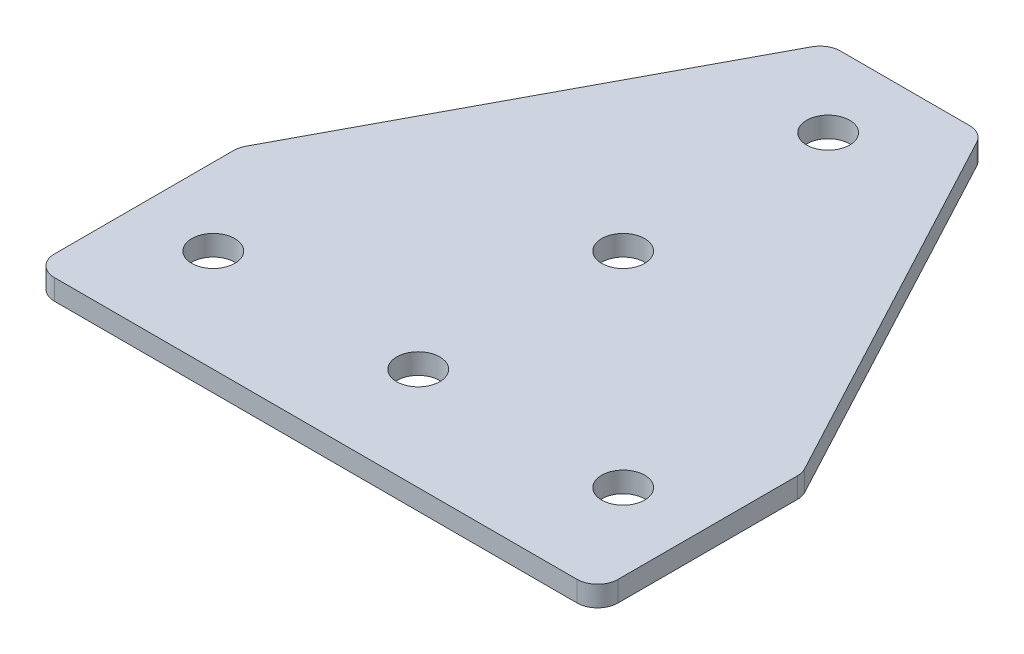
ISO-10303-21;
HEADER;
FILE_DESCRIPTION(('STEP AP214'),'2;1');
FILE_NAME('part.step','',(''),(''),'','','');
FILE_SCHEMA(('AUTOMOTIVE_DESIGN { 1 0 10303 214 1 1 1 1 }'));
ENDSEC;
DATA;
#1=APPLICATION_CONTEXT('core data for automotive mechanical design processes');
#2=APPLICATION_PROTOCOL_DEFINITION('international standard','automotive_design',2000,#1);
#3=PRODUCT_CONTEXT('',#1,'mechanical');
#4=PRODUCT('Part','Part','',(#3));
#5=PRODUCT_RELATED_PRODUCT_CATEGORY('part','',(#4));
#6=PRODUCT_DEFINITION_FORMATION('','',#4);
#7=PRODUCT_DEFINITION_CONTEXT('part definition',#1,'design');
#8=PRODUCT_DEFINITION('design','',#6,#7);
#9=PRODUCT_DEFINITION_SHAPE('','',#8);
#10=(LENGTH_UNIT() NAMED_UNIT(*) SI_UNIT(.MILLI.,.METRE.));
#11=(NAMED_UNIT(*) PLANE_ANGLE_UNIT() SI_UNIT($,.RADIAN.));
#12=(NAMED_UNIT(*) SI_UNIT($,.STERADIAN.) SOLID_ANGLE_UNIT());
#13=UNCERTAINTY_MEASURE_WITH_UNIT(LENGTH_MEASURE(1.E-05),#10,'distance_accuracy_value','');
#14=(GEOMETRIC_REPRESENTATION_CONTEXT(3) GLOBAL_UNCERTAINTY_ASSIGNED_CONTEXT((#13)) GLOBAL_UNIT_ASSIGNED_CONTEXT((#10,
#11,#12)) REPRESENTATION_CONTEXT('',''));
#15=CARTESIAN_POINT('',(0.,0.,0.));
#16=DIRECTION('',(0.,0.,1.));
#17=DIRECTION('',(1.,0.,0.));
#18=AXIS2_PLACEMENT_3D('',#15,#16,#17);
#19=CARTESIAN_POINT('',(0.,2.,0.));
#20=DIRECTION('',(0.,1.,0.));
#21=DIRECTION('',(0.,0.,1.));
#22=AXIS2_PLACEMENT_3D('',#19,#20,#21);
#23=PLANE('',#22);
#24=CARTESIAN_POINT('',(27.5,2.,-50.));
#25=DIRECTION('',(0.,1.,0.));
#26=DIRECTION('',(0.,0.,1.));
#27=AXIS2_PLACEMENT_3D('',#24,#25,#26);
#28=CIRCLE('',#27,2.1);
#29=CARTESIAN_POINT('',(27.5,2.,-47.9));
#30=VERTEX_POINT('',#29);
#31=EDGE_CURVE('E498',#30,#30,#28,.T.);
#32=ORIENTED_EDGE('',*,*,#31,.F.);
#33=EDGE_LOOP('',(#32));
#34=FACE_BOUND('',#33,.T.);
#35=CARTESIAN_POINT('',(47.5,2.,-10.));
#36=DIRECTION('',(0.,1.,0.));
#37=DIRECTION('',(0.,0.,-1.));
#38=AXIS2_PLACEMENT_3D('',#35,#36,#37);
#39=CIRCLE('',#38,2.1);
#40=CARTESIAN_POINT('',(47.5,2.,-12.1));
#41=VERTEX_POINT('',#40);
#42=EDGE_CURVE('E210',#41,#41,#39,.T.);
#43=ORIENTED_EDGE('',*,*,#42,.F.);
#44=EDGE_LOOP('',(#43));
#45=FACE_BOUND('',#44,.T.);
#46=DIRECTION('',(-0.470588235294118,0.,0.882352941176471));
#47=VECTOR('',#46,1.);
#48=CARTESIAN_POINT('',(20.,2.,-57.5));
#49=LINE('',#48,#47);
#50=CARTESIAN_POINT('',(19.4352941176471,2.,-56.4411764705882));
#51=VERTEX_POINT('',#50);
#52=CARTESIAN_POINT('',(0.235294117647056,2.,-20.4411764705882));
#53=VERTEX_POINT('',#52);
#54=EDGE_CURVE('E167',#51,#53,#49,.T.);
#55=ORIENTED_EDGE('',*,*,#54,.T.);
#56=CARTESIAN_POINT('',(2.,2.,-19.5));
#57=DIRECTION('',(0.,1.,0.));
#58=DIRECTION('',(0.,0.,1.));
#59=AXIS2_PLACEMENT_3D('',#56,#57,#58);
#60=CIRCLE('',#59,2.);
#61=CARTESIAN_POINT('',(0.,2.,-19.5));
#62=VERTEX_POINT('',#61);
#63=EDGE_CURVE('E229',#53,#62,#60,.T.);
#64=ORIENTED_EDGE('',*,*,#63,.T.);
#65=DIRECTION('',(0.,0.,1.));
#66=VECTOR('',#65,1.);
#67=CARTESIAN_POINT('',(0.,2.,-20.));
#68=LINE('',#67,#66);
#69=CARTESIAN_POINT('',(0.,2.,-2.));
#70=VERTEX_POINT('',#69);
#71=EDGE_CURVE('E149',#62,#70,#68,.T.);
#72=ORIENTED_EDGE('',*,*,#71,.T.);
#73=CARTESIAN_POINT('',(2.,2.,-2.));
#74=DIRECTION('',(0.,1.,0.));
#75=DIRECTION('',(0.,0.,1.));
#76=AXIS2_PLACEMENT_3D('',#73,#74,#75);
#77=CIRCLE('',#76,2.);
#78=CARTESIAN_POINT('',(2.,2.,0.));
#79=VERTEX_POINT('',#78);
#80=EDGE_CURVE('E225',#70,#79,#77,.T.);
#81=ORIENTED_EDGE('',*,*,#80,.T.);
#82=DIRECTION('',(1.,0.,0.));
#83=VECTOR('',#82,1.);
#84=CARTESIAN_POINT('',(0.,2.,0.));
#85=LINE('',#84,#83);
#86=CARTESIAN_POINT('',(53.,2.,0.));
#87=VERTEX_POINT('',#86);
#88=EDGE_CURVE('E214',#79,#87,#85,.T.);
#89=ORIENTED_EDGE('',*,*,#88,.T.);
#90=CARTESIAN_POINT('',(53.,2.,-2.));
#91=DIRECTION('',(0.,1.,0.));
#92=DIRECTION('',(0.,0.,1.));
#93=AXIS2_PLACEMENT_3D('',#90,#91,#92);
#94=CIRCLE('',#93,2.);
#95=CARTESIAN_POINT('',(55.,2.,-2.));
#96=VERTEX_POINT('',#95);
#97=EDGE_CURVE('E230',#87,#96,#94,.T.);
#98=ORIENTED_EDGE('',*,*,#97,.T.);
#99=DIRECTION('',(0.,0.,-1.));
#100=VECTOR('',#99,1.);
#101=CARTESIAN_POINT('',(55.,2.,0.));
#102=LINE('',#101,#100);
#103=CARTESIAN_POINT('',(55.,2.,-19.5));
#104=VERTEX_POINT('',#103);
#105=EDGE_CURVE('E271',#96,#104,#102,.T.);
#106=ORIENTED_EDGE('',*,*,#105,.T.);
#107=CARTESIAN_POINT('',(53.,2.,-19.5));
#108=DIRECTION('',(0.,1.,0.));
#109=DIRECTION('',(0.,0.,1.));
#110=AXIS2_PLACEMENT_3D('',#107,#108,#109);
#111=CIRCLE('',#110,2.);
#112=CARTESIAN_POINT('',(54.7647058823529,2.,-20.4411764705882));
#113=VERTEX_POINT('',#112);
#114=EDGE_CURVE('E279',#104,#113,#111,.T.);
#115=ORIENTED_EDGE('',*,*,#114,.T.);
#116=DIRECTION('',(-0.470588235294118,0.,-0.882352941176471));
#117=VECTOR('',#116,1.);
#118=CARTESIAN_POINT('',(55.,2.,-20.));
#119=LINE('',#118,#117);
#120=CARTESIAN_POINT('',(35.5647058823529,2.,-56.4411764705882));
#121=VERTEX_POINT('',#120);
#122=EDGE_CURVE('E255',#113,#121,#119,.T.);
#123=ORIENTED_EDGE('',*,*,#122,.T.);
#124=CARTESIAN_POINT('',(33.8,2.,-55.5));
#125=DIRECTION('',(0.,1.,0.));
#126=DIRECTION('',(0.,0.,1.));
#127=AXIS2_PLACEMENT_3D('',#124,#125,#126);
#128=CIRCLE('',#127,2.);
#129=CARTESIAN_POINT('',(33.8,2.,-57.5));
#130=VERTEX_POINT('',#129);
#131=EDGE_CURVE('E60',#121,#130,#128,.T.);
#132=ORIENTED_EDGE('',*,*,#131,.T.);
#133=DIRECTION('',(-1.,0.,0.));
#134=VECTOR('',#133,1.);
#135=CARTESIAN_POINT('',(35.,2.,-57.5));
#136=LINE('',#135,#134);
#137=CARTESIAN_POINT('',(21.2,2.,-57.5));
#138=VERTEX_POINT('',#137);
#139=EDGE_CURVE('E264',#130,#138,#136,.T.);
#140=ORIENTED_EDGE('',*,*,#139,.T.);
#141=CARTESIAN_POINT('',(21.2,2.,-55.5));
#142=DIRECTION('',(0.,1.,0.));
#143=DIRECTION('',(0.,0.,1.));
#144=AXIS2_PLACEMENT_3D('',#141,#142,#143);
#145=CIRCLE('',#144,2.);
#146=EDGE_CURVE('E192',#138,#51,#145,.T.);
#147=ORIENTED_EDGE('',*,*,#146,.T.);
#148=EDGE_LOOP('',(#55,#64,#72,#81,#89,#98,#106,#115,#123,#132,#140,#147));
#149=FACE_BOUND('',#148,.T.);
#150=CARTESIAN_POINT('',(7.5,2.,-10.));
#151=DIRECTION('',(0.,1.,0.));
#152=DIRECTION('',(0.,0.,1.));
#153=AXIS2_PLACEMENT_3D('',#150,#151,#152);
#154=CIRCLE('',#153,2.1);
#155=CARTESIAN_POINT('',(7.5,2.,-7.9));
#156=VERTEX_POINT('',#155);
#157=EDGE_CURVE('E157',#156,#156,#154,.T.);
#158=ORIENTED_EDGE('',*,*,#157,.F.);
#159=EDGE_LOOP('',(#158));
#160=FACE_BOUND('',#159,.T.);
#161=CARTESIAN_POINT('',(27.5,2.,-10.));
#162=DIRECTION('',(0.,1.,0.));
#163=DIRECTION('',(0.,0.,1.));
#164=AXIS2_PLACEMENT_3D('',#161,#162,#163);
#165=CIRCLE('',#164,2.1);
#166=CARTESIAN_POINT('',(27.5,2.,-7.9));
#167=VERTEX_POINT('',#166);
#168=EDGE_CURVE('E509',#167,#167,#165,.T.);
#169=ORIENTED_EDGE('',*,*,#168,.F.);
#170=EDGE_LOOP('',(#169));
#171=FACE_BOUND('',#170,.T.);
#172=CARTESIAN_POINT('',(27.5,2.,-30.));
#173=DIRECTION('',(0.,1.,0.));
#174=DIRECTION('',(0.,0.,1.));
#175=AXIS2_PLACEMENT_3D('',#172,#173,#174);
#176=CIRCLE('',#175,2.1);
#177=CARTESIAN_POINT('',(27.5,2.,-27.9));
#178=VERTEX_POINT('',#177);
#179=EDGE_CURVE('E492',#178,#178,#176,.T.);
#180=ORIENTED_EDGE('',*,*,#179,.F.);
#181=EDGE_LOOP('',(#180));
#182=FACE_BOUND('',#181,.T.);
#183=ADVANCED_FACE('F39',(#34,#45,#149,#160,#171,#182),#23,.T.);
#184=CARTESIAN_POINT('',(0.,0.,0.));
#185=DIRECTION('',(0.,1.,0.));
#186=DIRECTION('',(0.,0.,1.));
#187=AXIS2_PLACEMENT_3D('',#184,#185,#186);
#188=PLANE('',#187);
#189=DIRECTION('',(0.,0.,1.));
#190=VECTOR('',#189,1.);
#191=CARTESIAN_POINT('',(0.,0.,-20.));
#192=LINE('',#191,#190);
#193=CARTESIAN_POINT('',(0.,0.,-19.5));
#194=VERTEX_POINT('',#193);
#195=CARTESIAN_POINT('',(0.,0.,-2.));
#196=VERTEX_POINT('',#195);
#197=EDGE_CURVE('E146',#194,#196,#192,.T.);
#198=ORIENTED_EDGE('',*,*,#197,.F.);
#199=CARTESIAN_POINT('',(2.,0.,-19.5));
#200=DIRECTION('',(0.,1.,0.));
#201=DIRECTION('',(0.,0.,1.));
#202=AXIS2_PLACEMENT_3D('',#199,#200,#201);
#203=CIRCLE('',#202,2.);
#204=CARTESIAN_POINT('',(0.235294117647056,0.,-20.4411764705882));
#205=VERTEX_POINT('',#204);
#206=EDGE_CURVE('E129',#194,#205,#203,.F.);
#207=ORIENTED_EDGE('',*,*,#206,.T.);
#208=DIRECTION('',(-0.470588235294118,0.,0.882352941176471));
#209=VECTOR('',#208,1.);
#210=CARTESIAN_POINT('',(20.,0.,-57.5));
#211=LINE('',#210,#209);
#212=CARTESIAN_POINT('',(19.4352941176471,0.,-56.4411764705882));
#213=VERTEX_POINT('',#212);
#214=EDGE_CURVE('E178',#213,#205,#211,.T.);
#215=ORIENTED_EDGE('',*,*,#214,.F.);
#216=CARTESIAN_POINT('',(21.2,0.,-55.5));
#217=DIRECTION('',(0.,1.,0.));
#218=DIRECTION('',(0.,0.,1.));
#219=AXIS2_PLACEMENT_3D('',#216,#217,#218);
#220=CIRCLE('',#219,2.);
#221=CARTESIAN_POINT('',(21.2,0.,-57.5));
#222=VERTEX_POINT('',#221);
#223=EDGE_CURVE('E150',#213,#222,#220,.F.);
#224=ORIENTED_EDGE('',*,*,#223,.T.);
#225=DIRECTION('',(-1.,0.,0.));
#226=VECTOR('',#225,1.);
#227=CARTESIAN_POINT('',(35.,0.,-57.5));
#228=LINE('',#227,#226);
#229=CARTESIAN_POINT('',(33.8,0.,-57.5));
#230=VERTEX_POINT('',#229);
#231=EDGE_CURVE('E176',#230,#222,#228,.T.);
#232=ORIENTED_EDGE('',*,*,#231,.F.);
#233=CARTESIAN_POINT('',(33.8,0.,-55.5));
#234=DIRECTION('',(0.,1.,0.));
#235=DIRECTION('',(0.,0.,1.));
#236=AXIS2_PLACEMENT_3D('',#233,#234,#235);
#237=CIRCLE('',#236,2.);
#238=CARTESIAN_POINT('',(35.5647058823529,0.,-56.4411764705882));
#239=VERTEX_POINT('',#238);
#240=EDGE_CURVE('E182',#230,#239,#237,.F.);
#241=ORIENTED_EDGE('',*,*,#240,.T.);
#242=DIRECTION('',(-0.470588235294118,0.,-0.882352941176471));
#243=VECTOR('',#242,1.);
#244=CARTESIAN_POINT('',(55.,0.,-20.));
#245=LINE('',#244,#243);
#246=CARTESIAN_POINT('',(54.7647058823529,0.,-20.4411764705882));
#247=VERTEX_POINT('',#246);
#248=EDGE_CURVE('E173',#247,#239,#245,.T.);
#249=ORIENTED_EDGE('',*,*,#248,.F.);
#250=CARTESIAN_POINT('',(53.,0.,-19.5));
#251=DIRECTION('',(0.,1.,0.));
#252=DIRECTION('',(0.,0.,1.));
#253=AXIS2_PLACEMENT_3D('',#250,#251,#252);
#254=CIRCLE('',#253,2.);
#255=CARTESIAN_POINT('',(55.,0.,-19.5));
#256=VERTEX_POINT('',#255);
#257=EDGE_CURVE('E184',#247,#256,#254,.F.);
#258=ORIENTED_EDGE('',*,*,#257,.T.);
#259=DIRECTION('',(0.,0.,-1.));
#260=VECTOR('',#259,1.);
#261=CARTESIAN_POINT('',(55.,0.,0.));
#262=LINE('',#261,#260);
#263=CARTESIAN_POINT('',(55.,0.,-2.));
#264=VERTEX_POINT('',#263);
#265=EDGE_CURVE('E160',#264,#256,#262,.T.);
#266=ORIENTED_EDGE('',*,*,#265,.F.);
#267=CARTESIAN_POINT('',(53.,0.,-2.));
#268=DIRECTION('',(0.,1.,0.));
#269=DIRECTION('',(0.,0.,1.));
#270=AXIS2_PLACEMENT_3D('',#267,#268,#269);
#271=CIRCLE('',#270,2.);
#272=CARTESIAN_POINT('',(53.,0.,0.));
#273=VERTEX_POINT('',#272);
#274=EDGE_CURVE('E186',#264,#273,#271,.F.);
#275=ORIENTED_EDGE('',*,*,#274,.T.);
#276=DIRECTION('',(1.,0.,0.));
#277=VECTOR('',#276,1.);
#278=CARTESIAN_POINT('',(0.,0.,0.));
#279=LINE('',#278,#277);
#280=CARTESIAN_POINT('',(2.,0.,0.));
#281=VERTEX_POINT('',#280);
#282=EDGE_CURVE('E156',#281,#273,#279,.T.);
#283=ORIENTED_EDGE('',*,*,#282,.F.);
#284=CARTESIAN_POINT('',(2.,0.,-2.));
#285=DIRECTION('',(0.,1.,0.));
#286=DIRECTION('',(0.,0.,1.));
#287=AXIS2_PLACEMENT_3D('',#284,#285,#286);
#288=CIRCLE('',#287,2.);
#289=EDGE_CURVE('E140',#281,#196,#288,.F.);
#290=ORIENTED_EDGE('',*,*,#289,.T.);
#291=EDGE_LOOP('',(#198,#207,#215,#224,#232,#241,#249,#258,#266,#275,#283,#290));
#292=FACE_BOUND('',#291,.T.);
#293=CARTESIAN_POINT('',(7.5,0.,-10.));
#294=DIRECTION('',(0.,1.,0.));
#295=DIRECTION('',(0.,0.,1.));
#296=AXIS2_PLACEMENT_3D('',#293,#294,#295);
#297=CIRCLE('',#296,2.1);
#298=CARTESIAN_POINT('',(7.5,0.,-7.9));
#299=VERTEX_POINT('',#298);
#300=EDGE_CURVE('E164',#299,#299,#297,.T.);
#301=ORIENTED_EDGE('',*,*,#300,.T.);
#302=EDGE_LOOP('',(#301));
#303=FACE_BOUND('',#302,.T.);
#304=CARTESIAN_POINT('',(47.5,0.,-10.));
#305=DIRECTION('',(0.,1.,0.));
#306=DIRECTION('',(0.,0.,-1.));
#307=AXIS2_PLACEMENT_3D('',#304,#305,#306);
#308=CIRCLE('',#307,2.1);
#309=CARTESIAN_POINT('',(47.5,0.,-12.1));
#310=VERTEX_POINT('',#309);
#311=EDGE_CURVE('E206',#310,#310,#308,.T.);
#312=ORIENTED_EDGE('',*,*,#311,.T.);
#313=EDGE_LOOP('',(#312));
#314=FACE_BOUND('',#313,.T.);
#315=CARTESIAN_POINT('',(27.5,0.,-10.));
#316=DIRECTION('',(0.,1.,0.));
#317=DIRECTION('',(0.,0.,1.));
#318=AXIS2_PLACEMENT_3D('',#315,#316,#317);
#319=CIRCLE('',#318,2.1);
#320=CARTESIAN_POINT('',(27.5,0.,-7.9));
#321=VERTEX_POINT('',#320);
#322=EDGE_CURVE('E483',#321,#321,#319,.T.);
#323=ORIENTED_EDGE('',*,*,#322,.T.);
#324=EDGE_LOOP('',(#323));
#325=FACE_BOUND('',#324,.T.);
#326=CARTESIAN_POINT('',(27.5,0.,-50.));
#327=DIRECTION('',(0.,1.,0.));
#328=DIRECTION('',(0.,0.,1.));
#329=AXIS2_PLACEMENT_3D('',#326,#327,#328);
#330=CIRCLE('',#329,2.1);
#331=CARTESIAN_POINT('',(27.5,0.,-47.9));
#332=VERTEX_POINT('',#331);
#333=EDGE_CURVE('E487',#332,#332,#330,.T.);
#334=ORIENTED_EDGE('',*,*,#333,.T.);
#335=EDGE_LOOP('',(#334));
#336=FACE_BOUND('',#335,.T.);
#337=CARTESIAN_POINT('',(27.5,0.,-30.));
#338=DIRECTION('',(0.,1.,0.));
#339=DIRECTION('',(0.,0.,1.));
#340=AXIS2_PLACEMENT_3D('',#337,#338,#339);
#341=CIRCLE('',#340,2.1);
#342=CARTESIAN_POINT('',(27.5,0.,-27.9));
#343=VERTEX_POINT('',#342);
#344=EDGE_CURVE('E490',#343,#343,#341,.T.);
#345=ORIENTED_EDGE('',*,*,#344,.T.);
#346=EDGE_LOOP('',(#345));
#347=FACE_BOUND('',#346,.T.);
#348=ADVANCED_FACE('F153',(#292,#303,#314,#325,#336,#347),#188,.F.);
#349=CARTESIAN_POINT('',(0.,2.,-20.));
#350=DIRECTION('',(1.,0.,0.));
#351=DIRECTION('',(0.,0.,-1.));
#352=AXIS2_PLACEMENT_3D('',#349,#350,#351);
#353=PLANE('',#352);
#354=ORIENTED_EDGE('',*,*,#71,.F.);
#355=DIRECTION('',(0.,-1.,0.));
#356=VECTOR('',#355,1.);
#357=CARTESIAN_POINT('',(0.,2.,-19.5));
#358=LINE('',#357,#356);
#359=EDGE_CURVE('E133',#62,#194,#358,.T.);
#360=ORIENTED_EDGE('',*,*,#359,.T.);
#361=ORIENTED_EDGE('',*,*,#197,.T.);
#362=DIRECTION('',(0.,-1.,0.));
#363=VECTOR('',#362,1.);
#364=CARTESIAN_POINT('',(0.,2.,-2.));
#365=LINE('',#364,#363);
#366=EDGE_CURVE('E151',#196,#70,#365,.F.);
#367=ORIENTED_EDGE('',*,*,#366,.T.);
#368=EDGE_LOOP('',(#354,#360,#361,#367));
#369=FACE_BOUND('',#368,.T.);
#370=ADVANCED_FACE('F145',(#369),#353,.F.);
#371=CARTESIAN_POINT('',(0.,2.,0.));
#372=DIRECTION('',(0.,0.,-1.));
#373=DIRECTION('',(-1.,0.,0.));
#374=AXIS2_PLACEMENT_3D('',#371,#372,#373);
#375=PLANE('',#374);
#376=ORIENTED_EDGE('',*,*,#88,.F.);
#377=DIRECTION('',(0.,-1.,0.));
#378=VECTOR('',#377,1.);
#379=CARTESIAN_POINT('',(2.,2.,0.));
#380=LINE('',#379,#378);
#381=EDGE_CURVE('E237',#79,#281,#380,.T.);
#382=ORIENTED_EDGE('',*,*,#381,.T.);
#383=ORIENTED_EDGE('',*,*,#282,.T.);
#384=DIRECTION('',(0.,-1.,0.));
#385=VECTOR('',#384,1.);
#386=CARTESIAN_POINT('',(53.,2.,0.));
#387=LINE('',#386,#385);
#388=EDGE_CURVE('E235',#273,#87,#387,.F.);
#389=ORIENTED_EDGE('',*,*,#388,.T.);
#390=EDGE_LOOP('',(#376,#382,#383,#389));
#391=FACE_BOUND('',#390,.T.);
#392=ADVANCED_FACE('F299',(#391),#375,.F.);
#393=CARTESIAN_POINT('',(55.,2.,0.));
#394=DIRECTION('',(-1.,0.,0.));
#395=DIRECTION('',(0.,0.,1.));
#396=AXIS2_PLACEMENT_3D('',#393,#394,#395);
#397=PLANE('',#396);
#398=ORIENTED_EDGE('',*,*,#105,.F.);
#399=DIRECTION('',(0.,-1.,0.));
#400=VECTOR('',#399,1.);
#401=CARTESIAN_POINT('',(55.,2.,-2.));
#402=LINE('',#401,#400);
#403=EDGE_CURVE('E242',#96,#264,#402,.T.);
#404=ORIENTED_EDGE('',*,*,#403,.T.);
#405=ORIENTED_EDGE('',*,*,#265,.T.);
#406=DIRECTION('',(0.,-1.,0.));
#407=VECTOR('',#406,1.);
#408=CARTESIAN_POINT('',(55.,2.,-19.5));
#409=LINE('',#408,#407);
#410=EDGE_CURVE('E240',#256,#104,#409,.F.);
#411=ORIENTED_EDGE('',*,*,#410,.T.);
#412=EDGE_LOOP('',(#398,#404,#405,#411));
#413=FACE_BOUND('',#412,.T.);
#414=ADVANCED_FACE('F295',(#413),#397,.F.);
#415=CARTESIAN_POINT('',(55.,2.,-20.));
#416=DIRECTION('',(-0.882352941176471,0.,0.470588235294118));
#417=DIRECTION('',(0.470588235294118,0.,0.882352941176471));
#418=AXIS2_PLACEMENT_3D('',#415,#416,#417);
#419=PLANE('',#418);
#420=ORIENTED_EDGE('',*,*,#122,.F.);
#421=DIRECTION('',(0.,-1.,0.));
#422=VECTOR('',#421,1.);
#423=CARTESIAN_POINT('',(54.7647058823529,2.,-20.4411764705882));
#424=LINE('',#423,#422);
#425=EDGE_CURVE('E247',#113,#247,#424,.T.);
#426=ORIENTED_EDGE('',*,*,#425,.T.);
#427=ORIENTED_EDGE('',*,*,#248,.T.);
#428=DIRECTION('',(0.,-1.,0.));
#429=VECTOR('',#428,1.);
#430=CARTESIAN_POINT('',(35.5647058823529,2.,-56.4411764705882));
#431=LINE('',#430,#429);
#432=EDGE_CURVE('E245',#239,#121,#431,.F.);
#433=ORIENTED_EDGE('',*,*,#432,.T.);
#434=EDGE_LOOP('',(#420,#426,#427,#433));
#435=FACE_BOUND('',#434,.T.);
#436=ADVANCED_FACE('F253',(#435),#419,.F.);
#437=CARTESIAN_POINT('',(35.,2.,-57.5));
#438=DIRECTION('',(0.,0.,1.));
#439=DIRECTION('',(1.,0.,0.));
#440=AXIS2_PLACEMENT_3D('',#437,#438,#439);
#441=PLANE('',#440);
#442=ORIENTED_EDGE('',*,*,#139,.F.);
#443=DIRECTION('',(0.,-1.,0.));
#444=VECTOR('',#443,1.);
#445=CARTESIAN_POINT('',(33.8,2.,-57.5));
#446=LINE('',#445,#444);
#447=EDGE_CURVE('E12',#130,#230,#446,.T.);
#448=ORIENTED_EDGE('',*,*,#447,.T.);
#449=ORIENTED_EDGE('',*,*,#231,.T.);
#450=DIRECTION('',(0.,-1.,0.));
#451=VECTOR('',#450,1.);
#452=CARTESIAN_POINT('',(21.2,2.,-57.5));
#453=LINE('',#452,#451);
#454=EDGE_CURVE('E47',#222,#138,#453,.F.);
#455=ORIENTED_EDGE('',*,*,#454,.T.);
#456=EDGE_LOOP('',(#442,#448,#449,#455));
#457=FACE_BOUND('',#456,.T.);
#458=ADVANCED_FACE('F263',(#457),#441,.F.);
#459=CARTESIAN_POINT('',(20.,2.,-57.5));
#460=DIRECTION('',(0.882352941176471,0.,0.470588235294118));
#461=DIRECTION('',(0.470588235294118,0.,-0.882352941176471));
#462=AXIS2_PLACEMENT_3D('',#459,#460,#461);
#463=PLANE('',#462);
#464=ORIENTED_EDGE('',*,*,#214,.T.);
#465=DIRECTION('',(0.,-1.,0.));
#466=VECTOR('',#465,1.);
#467=CARTESIAN_POINT('',(0.235294117647056,2.,-20.4411764705882));
#468=LINE('',#467,#466);
#469=EDGE_CURVE('E134',#205,#53,#468,.F.);
#470=ORIENTED_EDGE('',*,*,#469,.T.);
#471=ORIENTED_EDGE('',*,*,#54,.F.);
#472=DIRECTION('',(0.,-1.,0.));
#473=VECTOR('',#472,1.);
#474=CARTESIAN_POINT('',(19.4352941176471,2.,-56.4411764705882));
#475=LINE('',#474,#473);
#476=EDGE_CURVE('E139',#51,#213,#475,.T.);
#477=ORIENTED_EDGE('',*,*,#476,.T.);
#478=EDGE_LOOP('',(#464,#470,#471,#477));
#479=FACE_BOUND('',#478,.T.);
#480=ADVANCED_FACE('F307',(#479),#463,.F.);
#481=CARTESIAN_POINT('',(7.5,2.,-10.));
#482=DIRECTION('',(0.,-1.,0.));
#483=DIRECTION('',(0.,0.,-1.));
#484=AXIS2_PLACEMENT_3D('',#481,#482,#483);
#485=CYLINDRICAL_SURFACE('',#484,2.1);
#486=ORIENTED_EDGE('',*,*,#157,.T.);
#487=EDGE_LOOP('',(#486));
#488=FACE_BOUND('',#487,.T.);
#489=ORIENTED_EDGE('',*,*,#300,.F.);
#490=EDGE_LOOP('',(#489));
#491=FACE_BOUND('',#490,.T.);
#492=ADVANCED_FACE('F324',(#488,#491),#485,.F.);
#493=CARTESIAN_POINT('',(47.5,2.,-10.));
#494=DIRECTION('',(0.,-1.,0.));
#495=DIRECTION('',(0.,0.,-1.));
#496=AXIS2_PLACEMENT_3D('',#493,#494,#495);
#497=CYLINDRICAL_SURFACE('',#496,2.1);
#498=ORIENTED_EDGE('',*,*,#42,.T.);
#499=EDGE_LOOP('',(#498));
#500=FACE_BOUND('',#499,.T.);
#501=ORIENTED_EDGE('',*,*,#311,.F.);
#502=EDGE_LOOP('',(#501));
#503=FACE_BOUND('',#502,.T.);
#504=ADVANCED_FACE('F404',(#500,#503),#497,.F.);
#505=CARTESIAN_POINT('',(27.5,2.,-10.));
#506=DIRECTION('',(0.,-1.,0.));
#507=DIRECTION('',(0.,0.,-1.));
#508=AXIS2_PLACEMENT_3D('',#505,#506,#507);
#509=CYLINDRICAL_SURFACE('',#508,2.1);
#510=ORIENTED_EDGE('',*,*,#168,.T.);
#511=EDGE_LOOP('',(#510));
#512=FACE_BOUND('',#511,.T.);
#513=ORIENTED_EDGE('',*,*,#322,.F.);
#514=EDGE_LOOP('',(#513));
#515=FACE_BOUND('',#514,.T.);
#516=ADVANCED_FACE('F395',(#512,#515),#509,.F.);
#517=CARTESIAN_POINT('',(27.5,2.,-50.));
#518=DIRECTION('',(0.,-1.,0.));
#519=DIRECTION('',(0.,0.,-1.));
#520=AXIS2_PLACEMENT_3D('',#517,#518,#519);
#521=CYLINDRICAL_SURFACE('',#520,2.1);
#522=ORIENTED_EDGE('',*,*,#31,.T.);
#523=EDGE_LOOP('',(#522));
#524=FACE_BOUND('',#523,.T.);
#525=ORIENTED_EDGE('',*,*,#333,.F.);
#526=EDGE_LOOP('',(#525));
#527=FACE_BOUND('',#526,.T.);
#528=ADVANCED_FACE('F386',(#524,#527),#521,.F.);
#529=CARTESIAN_POINT('',(27.5,2.,-30.));
#530=DIRECTION('',(0.,-1.,0.));
#531=DIRECTION('',(0.,0.,-1.));
#532=AXIS2_PLACEMENT_3D('',#529,#530,#531);
#533=CYLINDRICAL_SURFACE('',#532,2.1);
#534=ORIENTED_EDGE('',*,*,#179,.T.);
#535=EDGE_LOOP('',(#534));
#536=FACE_BOUND('',#535,.T.);
#537=ORIENTED_EDGE('',*,*,#344,.F.);
#538=EDGE_LOOP('',(#537));
#539=FACE_BOUND('',#538,.T.);
#540=ADVANCED_FACE('F341',(#536,#539),#533,.F.);
#541=CARTESIAN_POINT('',(2.,2.,-19.5));
#542=DIRECTION('',(0.,-1.,0.));
#543=DIRECTION('',(0.,0.,-1.));
#544=AXIS2_PLACEMENT_3D('',#541,#542,#543);
#545=CYLINDRICAL_SURFACE('',#544,2.);
#546=ORIENTED_EDGE('',*,*,#63,.F.);
#547=ORIENTED_EDGE('',*,*,#469,.F.);
#548=ORIENTED_EDGE('',*,*,#206,.F.);
#549=ORIENTED_EDGE('',*,*,#359,.F.);
#550=EDGE_LOOP('',(#546,#547,#548,#549));
#551=FACE_BOUND('',#550,.T.);
#552=ADVANCED_FACE('F132',(#551),#545,.T.);
#553=CARTESIAN_POINT('',(2.,2.,-2.));
#554=DIRECTION('',(0.,-1.,0.));
#555=DIRECTION('',(0.,0.,-1.));
#556=AXIS2_PLACEMENT_3D('',#553,#554,#555);
#557=CYLINDRICAL_SURFACE('',#556,2.);
#558=ORIENTED_EDGE('',*,*,#80,.F.);
#559=ORIENTED_EDGE('',*,*,#366,.F.);
#560=ORIENTED_EDGE('',*,*,#289,.F.);
#561=ORIENTED_EDGE('',*,*,#381,.F.);
#562=EDGE_LOOP('',(#558,#559,#560,#561));
#563=FACE_BOUND('',#562,.T.);
#564=ADVANCED_FACE('F303',(#563),#557,.T.);
#565=CARTESIAN_POINT('',(53.,2.,-2.));
#566=DIRECTION('',(0.,-1.,0.));
#567=DIRECTION('',(0.,0.,-1.));
#568=AXIS2_PLACEMENT_3D('',#565,#566,#567);
#569=CYLINDRICAL_SURFACE('',#568,2.);
#570=ORIENTED_EDGE('',*,*,#97,.F.);
#571=ORIENTED_EDGE('',*,*,#388,.F.);
#572=ORIENTED_EDGE('',*,*,#274,.F.);
#573=ORIENTED_EDGE('',*,*,#403,.F.);
#574=EDGE_LOOP('',(#570,#571,#572,#573));
#575=FACE_BOUND('',#574,.T.);
#576=ADVANCED_FACE('F297',(#575),#569,.T.);
#577=CARTESIAN_POINT('',(53.,2.,-19.5));
#578=DIRECTION('',(0.,-1.,0.));
#579=DIRECTION('',(0.,0.,-1.));
#580=AXIS2_PLACEMENT_3D('',#577,#578,#579);
#581=CYLINDRICAL_SURFACE('',#580,2.);
#582=ORIENTED_EDGE('',*,*,#114,.F.);
#583=ORIENTED_EDGE('',*,*,#410,.F.);
#584=ORIENTED_EDGE('',*,*,#257,.F.);
#585=ORIENTED_EDGE('',*,*,#425,.F.);
#586=EDGE_LOOP('',(#582,#583,#584,#585));
#587=FACE_BOUND('',#586,.T.);
#588=ADVANCED_FACE('F313',(#587),#581,.T.);
#589=CARTESIAN_POINT('',(33.8,2.,-55.5));
#590=DIRECTION('',(0.,-1.,0.));
#591=DIRECTION('',(0.,0.,-1.));
#592=AXIS2_PLACEMENT_3D('',#589,#590,#591);
#593=CYLINDRICAL_SURFACE('',#592,2.);
#594=ORIENTED_EDGE('',*,*,#131,.F.);
#595=ORIENTED_EDGE('',*,*,#432,.F.);
#596=ORIENTED_EDGE('',*,*,#240,.F.);
#597=ORIENTED_EDGE('',*,*,#447,.F.);
#598=EDGE_LOOP('',(#594,#595,#596,#597));
#599=FACE_BOUND('',#598,.T.);
#600=ADVANCED_FACE('F262',(#599),#593,.T.);
#601=CARTESIAN_POINT('',(21.2,2.,-55.5));
#602=DIRECTION('',(0.,-1.,0.));
#603=DIRECTION('',(0.,0.,-1.));
#604=AXIS2_PLACEMENT_3D('',#601,#602,#603);
#605=CYLINDRICAL_SURFACE('',#604,2.);
#606=ORIENTED_EDGE('',*,*,#146,.F.);
#607=ORIENTED_EDGE('',*,*,#454,.F.);
#608=ORIENTED_EDGE('',*,*,#223,.F.);
#609=ORIENTED_EDGE('',*,*,#476,.F.);
#610=EDGE_LOOP('',(#606,#607,#608,#609));
#611=FACE_BOUND('',#610,.T.);
#612=ADVANCED_FACE('F41',(#611),#605,.T.);
#613=CLOSED_SHELL('',(#183,#348,#370,#392,#414,#436,#458,#480,#492,#504,#516,#528,#540,#552,
#564,#576,#588,#600,#612));
#614=MANIFOLD_SOLID_BREP('B2',#613);
#615=ADVANCED_BREP_SHAPE_REPRESENTATION('',(#18,#614),#14);
#616=SHAPE_DEFINITION_REPRESENTATION(#9,#615);
ENDSEC;
END-ISO-10303-21;
